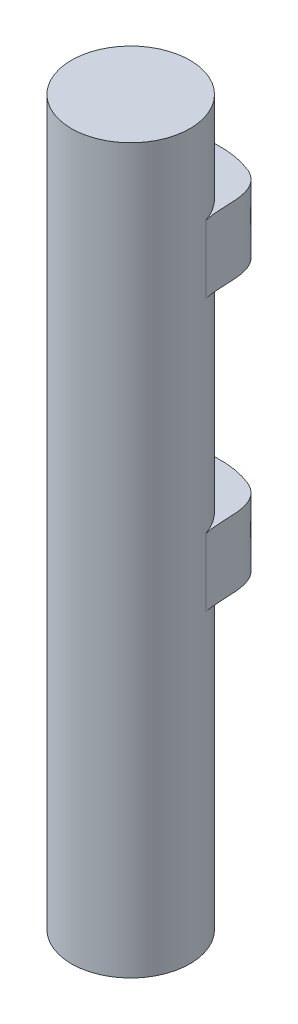
ISO-10303-21;
HEADER;
FILE_DESCRIPTION(('STEP AP214'),'2;1');
FILE_NAME('part.step','',(''),(''),'','','');
FILE_SCHEMA(('AUTOMOTIVE_DESIGN { 1 0 10303 214 1 1 1 1 }'));
ENDSEC;
DATA;
#1=APPLICATION_CONTEXT('core data for automotive mechanical design processes');
#2=APPLICATION_PROTOCOL_DEFINITION('international standard','automotive_design',2000,#1);
#3=PRODUCT_CONTEXT('',#1,'mechanical');
#4=PRODUCT('Part','Part','',(#3));
#5=PRODUCT_RELATED_PRODUCT_CATEGORY('part','',(#4));
#6=PRODUCT_DEFINITION_FORMATION('','',#4);
#7=PRODUCT_DEFINITION_CONTEXT('part definition',#1,'design');
#8=PRODUCT_DEFINITION('design','',#6,#7);
#9=PRODUCT_DEFINITION_SHAPE('','',#8);
#10=(LENGTH_UNIT() NAMED_UNIT(*) SI_UNIT(.MILLI.,.METRE.));
#11=(NAMED_UNIT(*) PLANE_ANGLE_UNIT() SI_UNIT($,.RADIAN.));
#12=(NAMED_UNIT(*) SI_UNIT($,.STERADIAN.) SOLID_ANGLE_UNIT());
#13=UNCERTAINTY_MEASURE_WITH_UNIT(LENGTH_MEASURE(1.E-05),#10,'distance_accuracy_value','');
#14=(GEOMETRIC_REPRESENTATION_CONTEXT(3) GLOBAL_UNCERTAINTY_ASSIGNED_CONTEXT((#13)) GLOBAL_UNIT_ASSIGNED_CONTEXT((#10,
#11,#12)) REPRESENTATION_CONTEXT('',''));
#15=CARTESIAN_POINT('',(0.,0.,0.));
#16=DIRECTION('',(0.,0.,1.));
#17=DIRECTION('',(1.,0.,0.));
#18=AXIS2_PLACEMENT_3D('',#15,#16,#17);
#19=CARTESIAN_POINT('',(0.,203.2,0.));
#20=DIRECTION('',(0.,-1.,0.));
#21=DIRECTION('',(0.,0.,-1.));
#22=AXIS2_PLACEMENT_3D('',#19,#20,#21);
#23=CYLINDRICAL_SURFACE('',#22,25.273);
#24=CARTESIAN_POINT('',(0.,82.55,0.));
#25=DIRECTION('',(0.,-1.,0.));
#26=DIRECTION('',(0.,0.,-1.));
#27=AXIS2_PLACEMENT_3D('',#24,#25,#26);
#28=CIRCLE('',#27,25.273);
#29=CARTESIAN_POINT('',(-6.76559254801558,82.55,-24.3505910908596));
#30=VERTEX_POINT('',#29);
#31=CARTESIAN_POINT('',(9.65128559325508,82.55,-23.3575943837851));
#32=VERTEX_POINT('',#31);
#33=EDGE_CURVE('E131',#30,#32,#28,.T.);
#34=ORIENTED_EDGE('',*,*,#33,.F.);
#35=DIRECTION('',(0.,1.,0.));
#36=VECTOR('',#35,1.);
#37=CARTESIAN_POINT('',(-6.76559254802124,0.,-24.3505910908577));
#38=LINE('',#37,#36);
#39=CARTESIAN_POINT('',(-6.76559254801639,101.6,-24.3505910908594));
#40=VERTEX_POINT('',#39);
#41=EDGE_CURVE('E213',#30,#40,#38,.T.);
#42=ORIENTED_EDGE('',*,*,#41,.T.);
#43=CARTESIAN_POINT('',(0.,101.6,0.));
#44=DIRECTION('',(0.,1.,0.));
#45=DIRECTION('',(0.,0.,1.));
#46=AXIS2_PLACEMENT_3D('',#43,#44,#45);
#47=CIRCLE('',#46,25.273);
#48=CARTESIAN_POINT('',(9.65128559325508,101.6,-23.3575943837851));
#49=VERTEX_POINT('',#48);
#50=EDGE_CURVE('E280',#49,#40,#47,.T.);
#51=ORIENTED_EDGE('',*,*,#50,.F.);
#52=DIRECTION('',(0.,1.,0.));
#53=VECTOR('',#52,1.);
#54=CARTESIAN_POINT('',(9.65128559325508,0.,-23.3575943837851));
#55=LINE('',#54,#53);
#56=EDGE_CURVE('E13',#32,#49,#55,.T.);
#57=ORIENTED_EDGE('',*,*,#56,.F.);
#58=EDGE_LOOP('',(#34,#42,#51,#57));
#59=FACE_BOUND('',#58,.T.);
#60=ADVANCED_FACE('F56',(#59),#23,.T.);
#61=CARTESIAN_POINT('',(16.1314288115535,0.,-4.12183388648582));
#62=CARTESIAN_POINT('',(13.5508846708614,0.,-11.4426723232787));
#63=CARTESIAN_POINT('',(18.501069430193,0.,-21.9117684936583));
#64=CARTESIAN_POINT('',(6.04784747017981,0.,-24.5387055481221));
#65=B_SPLINE_CURVE_WITH_KNOTS('',3,(#61,#62,#63,#64),.UNSPECIFIED.,.F.,.F.,(4,4),(0.,1.),.UNSPECIFIED.);
#66=DIRECTION('',(0.,1.,0.));
#67=VECTOR('',#66,1.);
#68=SURFACE_OF_LINEAR_EXTRUSION('',#65,#67);
#69=DIRECTION('',(0.,1.,0.));
#70=VECTOR('',#69,1.);
#71=CARTESIAN_POINT('',(15.7831437961163,0.,-5.30140377646492));
#72=LINE('',#71,#70);
#73=CARTESIAN_POINT('',(15.7831437961163,82.55,-5.30140377646492));
#74=VERTEX_POINT('',#73);
#75=CARTESIAN_POINT('',(15.7831437961163,101.6,-5.30140377646492));
#76=VERTEX_POINT('',#75);
#77=EDGE_CURVE('E60',#74,#76,#72,.T.);
#78=ORIENTED_EDGE('',*,*,#77,.F.);
#79=CARTESIAN_POINT('',(16.1314288115535,82.55,-4.12183388648582));
#80=CARTESIAN_POINT('',(13.5508846708614,82.55,-11.4426723232787));
#81=CARTESIAN_POINT('',(18.501069430193,82.55,-21.9117684936583));
#82=CARTESIAN_POINT('',(6.04784747017981,82.55,-24.5387055481221));
#83=B_SPLINE_CURVE_WITH_KNOTS('',3,(#79,#80,#81,#82),.UNSPECIFIED.,.F.,.F.,(4,4),(0.,1.),.UNSPECIFIED.);
#84=EDGE_CURVE('E126',#74,#32,#83,.T.);
#85=ORIENTED_EDGE('',*,*,#84,.T.);
#86=ORIENTED_EDGE('',*,*,#56,.T.);
#87=CARTESIAN_POINT('',(16.1314288115535,101.6,-4.12183388648582));
#88=CARTESIAN_POINT('',(13.5508846708614,101.6,-11.4426723232787));
#89=CARTESIAN_POINT('',(18.501069430193,101.6,-21.9117684936583));
#90=CARTESIAN_POINT('',(6.04784747017981,101.6,-24.5387055481221));
#91=B_SPLINE_CURVE_WITH_KNOTS('',3,(#87,#88,#89,#90),.UNSPECIFIED.,.F.,.F.,(4,4),(0.,1.),.UNSPECIFIED.);
#92=EDGE_CURVE('E148',#49,#76,#91,.F.);
#93=ORIENTED_EDGE('',*,*,#92,.T.);
#94=EDGE_LOOP('',(#78,#85,#86,#93));
#95=FACE_BOUND('',#94,.T.);
#96=ADVANCED_FACE('F146',(#95),#68,.T.);
#97=CARTESIAN_POINT('',(-16.1314288115535,0.,-4.12183388648582));
#98=CARTESIAN_POINT('',(-13.2335692862072,0.,-7.9922166558362));
#99=CARTESIAN_POINT('',(-17.8745809464897,0.,-25.2502762616383));
#100=CARTESIAN_POINT('',(1.54881108308508,0.,-26.2881271800789));
#101=CARTESIAN_POINT('',(6.0478474701798,0.,-24.5387055481221));
#102=B_SPLINE_CURVE_WITH_KNOTS('',3,(#97,#98,#99,#100,#101),.UNSPECIFIED.,.F.,.F.,(4,1,4),(0.,
0.45984443686264,1.),.UNSPECIFIED.);
#103=DIRECTION('',(0.,1.,0.));
#104=VECTOR('',#103,1.);
#105=SURFACE_OF_LINEAR_EXTRUSION('',#102,#104);
#106=CARTESIAN_POINT('',(-16.1314288115535,82.55,-4.12183388648582));
#107=CARTESIAN_POINT('',(-13.2335692862072,82.55,-7.9922166558362));
#108=CARTESIAN_POINT('',(-17.8745809464897,82.55,-25.2502762616383));
#109=CARTESIAN_POINT('',(1.54881108308508,82.55,-26.2881271800789));
#110=CARTESIAN_POINT('',(6.0478474701798,82.55,-24.5387055481221));
#111=B_SPLINE_CURVE_WITH_KNOTS('',3,(#106,#107,#108,#109,#110),.UNSPECIFIED.,.F.,.F.,(4,1,4),
(0.,0.45984443686264,1.),.UNSPECIFIED.);
#112=CARTESIAN_POINT('',(-14.7247929164416,82.55,-7.77129227721572));
#113=VERTEX_POINT('',#112);
#114=EDGE_CURVE('E143',#113,#30,#111,.T.);
#115=ORIENTED_EDGE('',*,*,#114,.F.);
#116=DIRECTION('',(0.,1.,0.));
#117=VECTOR('',#116,1.);
#118=CARTESIAN_POINT('',(-14.7247929164416,0.,-7.77129227721571));
#119=LINE('',#118,#117);
#120=CARTESIAN_POINT('',(-14.7247929164416,101.6,-7.77129227721571));
#121=VERTEX_POINT('',#120);
#122=EDGE_CURVE('E74',#113,#121,#119,.T.);
#123=ORIENTED_EDGE('',*,*,#122,.T.);
#124=CARTESIAN_POINT('',(-16.1314288115535,101.6,-4.12183388648582));
#125=CARTESIAN_POINT('',(-13.2335692862072,101.6,-7.9922166558362));
#126=CARTESIAN_POINT('',(-17.8745809464897,101.6,-25.2502762616383));
#127=CARTESIAN_POINT('',(1.54881108308508,101.6,-26.2881271800789));
#128=CARTESIAN_POINT('',(6.0478474701798,101.6,-24.5387055481221));
#129=B_SPLINE_CURVE_WITH_KNOTS('',3,(#124,#125,#126,#127,#128),.UNSPECIFIED.,.F.,.F.,(4,1,4),
(0.,0.45984443686264,1.),.UNSPECIFIED.);
#130=EDGE_CURVE('E218',#40,#121,#129,.F.);
#131=ORIENTED_EDGE('',*,*,#130,.F.);
#132=ORIENTED_EDGE('',*,*,#41,.F.);
#133=EDGE_LOOP('',(#115,#123,#131,#132));
#134=FACE_BOUND('',#133,.T.);
#135=ADVANCED_FACE('F186',(#134),#105,.F.);
#136=CARTESIAN_POINT('',(0.,0.,0.));
#137=DIRECTION('',(0.,1.,0.));
#138=DIRECTION('',(0.,0.,1.));
#139=AXIS2_PLACEMENT_3D('',#136,#137,#138);
#140=PLANE('',#139);
#141=CARTESIAN_POINT('',(0.,0.,0.));
#142=DIRECTION('',(0.,1.,0.));
#143=DIRECTION('',(0.,0.,1.));
#144=AXIS2_PLACEMENT_3D('',#141,#142,#143);
#145=CIRCLE('',#144,16.6497);
#146=CARTESIAN_POINT('',(0.,0.,16.6497));
#147=VERTEX_POINT('',#146);
#148=EDGE_CURVE('E153',#147,#147,#145,.T.);
#149=ORIENTED_EDGE('',*,*,#148,.F.);
#150=EDGE_LOOP('',(#149));
#151=FACE_BOUND('',#150,.T.);
#152=ADVANCED_FACE('F196',(#151),#140,.F.);
#153=CARTESIAN_POINT('',(9.65128559325508,158.75,-23.3575943837851));
#154=VERTEX_POINT('',#153);
#155=CARTESIAN_POINT('',(9.65128559325508,177.8,-23.3575943837851));
#156=VERTEX_POINT('',#155);
#157=EDGE_CURVE('E66',#154,#156,#55,.T.);
#158=ORIENTED_EDGE('',*,*,#157,.F.);
#159=CARTESIAN_POINT('',(0.,158.75,0.));
#160=DIRECTION('',(0.,1.,0.));
#161=DIRECTION('',(0.,0.,1.));
#162=AXIS2_PLACEMENT_3D('',#159,#160,#161);
#163=CIRCLE('',#162,25.273);
#164=CARTESIAN_POINT('',(-6.76559254801639,158.75,-24.3505910908594));
#165=VERTEX_POINT('',#164);
#166=EDGE_CURVE('E231',#154,#165,#163,.T.);
#167=ORIENTED_EDGE('',*,*,#166,.T.);
#168=CARTESIAN_POINT('',(-6.76559254801801,177.8,-24.3505910908588));
#169=VERTEX_POINT('',#168);
#170=EDGE_CURVE('E220',#165,#169,#38,.T.);
#171=ORIENTED_EDGE('',*,*,#170,.T.);
#172=CARTESIAN_POINT('',(0.,177.8,0.));
#173=DIRECTION('',(0.,1.,0.));
#174=DIRECTION('',(0.,0.,1.));
#175=AXIS2_PLACEMENT_3D('',#172,#173,#174);
#176=CIRCLE('',#175,25.273);
#177=EDGE_CURVE('E230',#156,#169,#176,.T.);
#178=ORIENTED_EDGE('',*,*,#177,.F.);
#179=EDGE_LOOP('',(#158,#167,#171,#178));
#180=FACE_BOUND('',#179,.T.);
#181=ADVANCED_FACE('F58',(#180),#23,.T.);
#182=CARTESIAN_POINT('',(16.1314288115535,158.75,-4.12183388648582));
#183=CARTESIAN_POINT('',(13.5508846708614,158.75,-11.4426723232787));
#184=CARTESIAN_POINT('',(18.501069430193,158.75,-21.9117684936583));
#185=CARTESIAN_POINT('',(6.04784747017981,158.75,-24.5387055481221));
#186=B_SPLINE_CURVE_WITH_KNOTS('',3,(#182,#183,#184,#185),.UNSPECIFIED.,.F.,.F.,(4,4),(0.,1.),.UNSPECIFIED.);
#187=CARTESIAN_POINT('',(15.7831437961163,158.75,-5.30140377646492));
#188=VERTEX_POINT('',#187);
#189=EDGE_CURVE('E243',#154,#188,#186,.F.);
#190=ORIENTED_EDGE('',*,*,#189,.F.);
#191=ORIENTED_EDGE('',*,*,#157,.T.);
#192=CARTESIAN_POINT('',(16.1314288115535,177.8,-4.12183388648582));
#193=CARTESIAN_POINT('',(13.5508846708614,177.8,-11.4426723232787));
#194=CARTESIAN_POINT('',(18.501069430193,177.8,-21.9117684936583));
#195=CARTESIAN_POINT('',(6.04784747017981,177.8,-24.5387055481221));
#196=B_SPLINE_CURVE_WITH_KNOTS('',3,(#192,#193,#194,#195),.UNSPECIFIED.,.F.,.F.,(4,4),(0.,1.),.UNSPECIFIED.);
#197=CARTESIAN_POINT('',(15.7831437961163,177.8,-5.30140377646492));
#198=VERTEX_POINT('',#197);
#199=EDGE_CURVE('E165',#156,#198,#196,.F.);
#200=ORIENTED_EDGE('',*,*,#199,.T.);
#201=EDGE_CURVE('E150',#188,#198,#72,.T.);
#202=ORIENTED_EDGE('',*,*,#201,.F.);
#203=EDGE_LOOP('',(#190,#191,#200,#202));
#204=FACE_BOUND('',#203,.T.);
#205=ADVANCED_FACE('F185',(#204),#68,.T.);
#206=ORIENTED_EDGE('',*,*,#170,.F.);
#207=CARTESIAN_POINT('',(-16.1314288115535,158.75,-4.12183388648582));
#208=CARTESIAN_POINT('',(-13.2335692862072,158.75,-7.9922166558362));
#209=CARTESIAN_POINT('',(-17.8745809464897,158.75,-25.2502762616383));
#210=CARTESIAN_POINT('',(1.54881108308508,158.75,-26.2881271800789));
#211=CARTESIAN_POINT('',(6.0478474701798,158.75,-24.5387055481221));
#212=B_SPLINE_CURVE_WITH_KNOTS('',3,(#207,#208,#209,#210,#211),.UNSPECIFIED.,.F.,.F.,(4,1,4),
(0.,0.45984443686264,1.),.UNSPECIFIED.);
#213=CARTESIAN_POINT('',(-14.7247929164416,158.75,-7.77129227721572));
#214=VERTEX_POINT('',#213);
#215=EDGE_CURVE('E261',#165,#214,#212,.F.);
#216=ORIENTED_EDGE('',*,*,#215,.T.);
#217=CARTESIAN_POINT('',(-14.7247929164416,177.8,-7.77129227721571));
#218=VERTEX_POINT('',#217);
#219=EDGE_CURVE('E82',#214,#218,#119,.T.);
#220=ORIENTED_EDGE('',*,*,#219,.T.);
#221=CARTESIAN_POINT('',(-16.1314288115535,177.8,-4.12183388648582));
#222=CARTESIAN_POINT('',(-13.2335692862072,177.8,-7.9922166558362));
#223=CARTESIAN_POINT('',(-17.8745809464897,177.8,-25.2502762616383));
#224=CARTESIAN_POINT('',(1.54881108308508,177.8,-26.2881271800789));
#225=CARTESIAN_POINT('',(6.0478474701798,177.8,-24.5387055481221));
#226=B_SPLINE_CURVE_WITH_KNOTS('',3,(#221,#222,#223,#224,#225),.UNSPECIFIED.,.F.,.F.,(4,1,4),
(0.,0.45984443686264,1.),.UNSPECIFIED.);
#227=EDGE_CURVE('E235',#169,#218,#226,.F.);
#228=ORIENTED_EDGE('',*,*,#227,.F.);
#229=EDGE_LOOP('',(#206,#216,#220,#228));
#230=FACE_BOUND('',#229,.T.);
#231=ADVANCED_FACE('F180',(#230),#105,.F.);
#232=CARTESIAN_POINT('',(0.,203.2,0.));
#233=DIRECTION('',(0.,1.,0.));
#234=DIRECTION('',(0.,0.,1.));
#235=AXIS2_PLACEMENT_3D('',#232,#233,#234);
#236=PLANE('',#235);
#237=CARTESIAN_POINT('',(0.,203.2,0.));
#238=DIRECTION('',(0.,1.,0.));
#239=DIRECTION('',(0.,0.,1.));
#240=AXIS2_PLACEMENT_3D('',#237,#238,#239);
#241=CIRCLE('',#240,16.6497);
#242=CARTESIAN_POINT('',(0.,203.2,16.6497));
#243=VERTEX_POINT('',#242);
#244=EDGE_CURVE('E160',#243,#243,#241,.T.);
#245=ORIENTED_EDGE('',*,*,#244,.T.);
#246=EDGE_LOOP('',(#245));
#247=FACE_BOUND('',#246,.T.);
#248=ADVANCED_FACE('F184',(#247),#236,.T.);
#249=CARTESIAN_POINT('',(0.,0.,0.));
#250=DIRECTION('',(0.,1.,0.));
#251=DIRECTION('',(0.,0.,1.));
#252=AXIS2_PLACEMENT_3D('',#249,#250,#251);
#253=CYLINDRICAL_SURFACE('',#252,16.6497);
#254=CARTESIAN_POINT('',(0.,82.55,0.));
#255=DIRECTION('',(0.,-1.,0.));
#256=DIRECTION('',(0.,0.,-1.));
#257=AXIS2_PLACEMENT_3D('',#254,#255,#256);
#258=CIRCLE('',#257,16.6497);
#259=EDGE_CURVE('E129',#113,#74,#258,.T.);
#260=ORIENTED_EDGE('',*,*,#259,.T.);
#261=ORIENTED_EDGE('',*,*,#77,.T.);
#262=CARTESIAN_POINT('',(0.,101.6,0.));
#263=DIRECTION('',(0.,1.,0.));
#264=DIRECTION('',(0.,0.,1.));
#265=AXIS2_PLACEMENT_3D('',#262,#263,#264);
#266=CIRCLE('',#265,16.6497);
#267=EDGE_CURVE('E136',#76,#121,#266,.T.);
#268=ORIENTED_EDGE('',*,*,#267,.T.);
#269=ORIENTED_EDGE('',*,*,#122,.F.);
#270=EDGE_LOOP('',(#260,#261,#268,#269));
#271=FACE_BOUND('',#270,.T.);
#272=ORIENTED_EDGE('',*,*,#148,.T.);
#273=EDGE_LOOP('',(#272));
#274=FACE_BOUND('',#273,.T.);
#275=CARTESIAN_POINT('',(0.,158.75,0.));
#276=DIRECTION('',(0.,1.,0.));
#277=DIRECTION('',(0.,0.,1.));
#278=AXIS2_PLACEMENT_3D('',#275,#276,#277);
#279=CIRCLE('',#278,16.6497);
#280=EDGE_CURVE('E290',#188,#214,#279,.T.);
#281=ORIENTED_EDGE('',*,*,#280,.F.);
#282=ORIENTED_EDGE('',*,*,#201,.T.);
#283=CARTESIAN_POINT('',(0.,177.8,0.));
#284=DIRECTION('',(0.,1.,0.));
#285=DIRECTION('',(0.,0.,1.));
#286=AXIS2_PLACEMENT_3D('',#283,#284,#285);
#287=CIRCLE('',#286,16.6497);
#288=EDGE_CURVE('E240',#198,#218,#287,.T.);
#289=ORIENTED_EDGE('',*,*,#288,.T.);
#290=ORIENTED_EDGE('',*,*,#219,.F.);
#291=EDGE_LOOP('',(#281,#282,#289,#290));
#292=FACE_BOUND('',#291,.T.);
#293=ORIENTED_EDGE('',*,*,#244,.F.);
#294=EDGE_LOOP('',(#293));
#295=FACE_BOUND('',#294,.T.);
#296=ADVANCED_FACE('F139',(#271,#274,#292,#295),#253,.T.);
#297=CARTESIAN_POINT('',(0.,177.8,-4.31165));
#298=DIRECTION('',(0.,1.,0.));
#299=DIRECTION('',(0.,0.,1.));
#300=AXIS2_PLACEMENT_3D('',#297,#298,#299);
#301=PLANE('',#300);
#302=ORIENTED_EDGE('',*,*,#177,.T.);
#303=ORIENTED_EDGE('',*,*,#227,.T.);
#304=ORIENTED_EDGE('',*,*,#288,.F.);
#305=ORIENTED_EDGE('',*,*,#199,.F.);
#306=EDGE_LOOP('',(#302,#303,#304,#305));
#307=FACE_BOUND('',#306,.T.);
#308=ADVANCED_FACE('F187',(#307),#301,.T.);
#309=CARTESIAN_POINT('',(0.,158.75,-4.31165));
#310=DIRECTION('',(0.,1.,0.));
#311=DIRECTION('',(0.,0.,1.));
#312=AXIS2_PLACEMENT_3D('',#309,#310,#311);
#313=PLANE('',#312);
#314=ORIENTED_EDGE('',*,*,#189,.T.);
#315=ORIENTED_EDGE('',*,*,#280,.T.);
#316=ORIENTED_EDGE('',*,*,#215,.F.);
#317=ORIENTED_EDGE('',*,*,#166,.F.);
#318=EDGE_LOOP('',(#314,#315,#316,#317));
#319=FACE_BOUND('',#318,.T.);
#320=ADVANCED_FACE('F309',(#319),#313,.F.);
#321=CARTESIAN_POINT('',(0.,101.6,-4.31165));
#322=DIRECTION('',(0.,1.,0.));
#323=DIRECTION('',(0.,0.,1.));
#324=AXIS2_PLACEMENT_3D('',#321,#322,#323);
#325=PLANE('',#324);
#326=ORIENTED_EDGE('',*,*,#50,.T.);
#327=ORIENTED_EDGE('',*,*,#130,.T.);
#328=ORIENTED_EDGE('',*,*,#267,.F.);
#329=ORIENTED_EDGE('',*,*,#92,.F.);
#330=EDGE_LOOP('',(#326,#327,#328,#329));
#331=FACE_BOUND('',#330,.T.);
#332=ADVANCED_FACE('F313',(#331),#325,.T.);
#333=CARTESIAN_POINT('',(0.,82.55,-4.31165));
#334=DIRECTION('',(0.,-1.,0.));
#335=DIRECTION('',(0.,0.,-1.));
#336=AXIS2_PLACEMENT_3D('',#333,#334,#335);
#337=PLANE('',#336);
#338=ORIENTED_EDGE('',*,*,#259,.F.);
#339=ORIENTED_EDGE('',*,*,#114,.T.);
#340=ORIENTED_EDGE('',*,*,#33,.T.);
#341=ORIENTED_EDGE('',*,*,#84,.F.);
#342=EDGE_LOOP('',(#338,#339,#340,#341));
#343=FACE_BOUND('',#342,.T.);
#344=ADVANCED_FACE('F128',(#343),#337,.T.);
#345=CLOSED_SHELL('',(#60,#96,#135,#152,#181,#205,#231,#248,#296,#308,#320,#332,#344));
#346=MANIFOLD_SOLID_BREP('B2',#345);
#347=ADVANCED_BREP_SHAPE_REPRESENTATION('',(#18,#346),#14);
#348=SHAPE_DEFINITION_REPRESENTATION(#9,#347);
ENDSEC;
END-ISO-10303-21;
